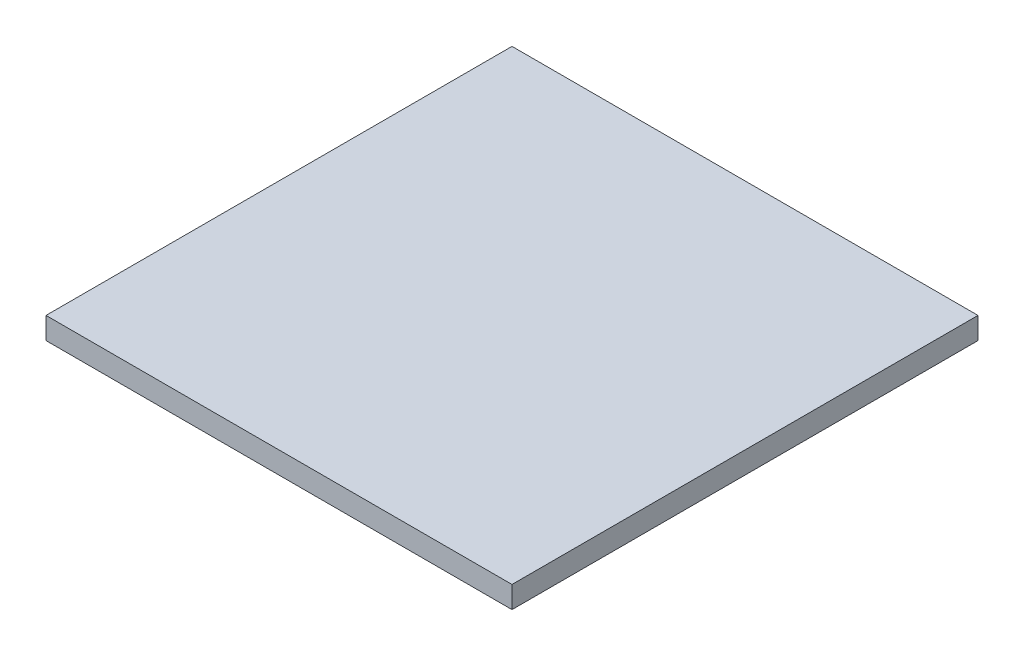
ISO-10303-21;
HEADER;
FILE_DESCRIPTION(('STEP AP214'),'2;1');
FILE_NAME('part.step','',(''),(''),'','','');
FILE_SCHEMA(('AUTOMOTIVE_DESIGN { 1 0 10303 214 1 1 1 1 }'));
ENDSEC;
DATA;
#1=APPLICATION_CONTEXT('core data for automotive mechanical design processes');
#2=APPLICATION_PROTOCOL_DEFINITION('international standard','automotive_design',2000,#1);
#3=PRODUCT_CONTEXT('',#1,'mechanical');
#4=PRODUCT('Part','Part','',(#3));
#5=PRODUCT_RELATED_PRODUCT_CATEGORY('part','',(#4));
#6=PRODUCT_DEFINITION_FORMATION('','',#4);
#7=PRODUCT_DEFINITION_CONTEXT('part definition',#1,'design');
#8=PRODUCT_DEFINITION('design','',#6,#7);
#9=PRODUCT_DEFINITION_SHAPE('','',#8);
#10=(LENGTH_UNIT() NAMED_UNIT(*) SI_UNIT(.MILLI.,.METRE.));
#11=(NAMED_UNIT(*) PLANE_ANGLE_UNIT() SI_UNIT($,.RADIAN.));
#12=(NAMED_UNIT(*) SI_UNIT($,.STERADIAN.) SOLID_ANGLE_UNIT());
#13=UNCERTAINTY_MEASURE_WITH_UNIT(LENGTH_MEASURE(1.E-05),#10,'distance_accuracy_value','');
#14=(GEOMETRIC_REPRESENTATION_CONTEXT(3) GLOBAL_UNCERTAINTY_ASSIGNED_CONTEXT((#13)) GLOBAL_UNIT_ASSIGNED_CONTEXT((#10,
#11,#12)) REPRESENTATION_CONTEXT('',''));
#15=CARTESIAN_POINT('',(0.,0.,0.));
#16=DIRECTION('',(0.,0.,1.));
#17=DIRECTION('',(1.,0.,0.));
#18=AXIS2_PLACEMENT_3D('',#15,#16,#17);
#19=CARTESIAN_POINT('',(149.225,13.97,149.225));
#20=DIRECTION('',(-1.,0.,0.));
#21=DIRECTION('',(0.,0.,1.));
#22=AXIS2_PLACEMENT_3D('',#19,#20,#21);
#23=PLANE('',#22);
#24=DIRECTION('',(0.,0.,-1.));
#25=VECTOR('',#24,1.);
#26=CARTESIAN_POINT('',(149.225,0.,149.225));
#27=LINE('',#26,#25);
#28=CARTESIAN_POINT('',(149.225,0.,149.225));
#29=VERTEX_POINT('',#28);
#30=CARTESIAN_POINT('',(149.225,0.,-149.225));
#31=VERTEX_POINT('',#30);
#32=EDGE_CURVE('E109',#29,#31,#27,.T.);
#33=ORIENTED_EDGE('',*,*,#32,.T.);
#34=DIRECTION('',(0.,-1.,0.));
#35=VECTOR('',#34,1.);
#36=CARTESIAN_POINT('',(149.225,13.97,-149.225));
#37=LINE('',#36,#35);
#38=CARTESIAN_POINT('',(149.225,13.97,-149.225));
#39=VERTEX_POINT('',#38);
#40=EDGE_CURVE('E11',#39,#31,#37,.T.);
#41=ORIENTED_EDGE('',*,*,#40,.F.);
#42=DIRECTION('',(0.,0.,-1.));
#43=VECTOR('',#42,1.);
#44=CARTESIAN_POINT('',(149.225,13.97,149.225));
#45=LINE('',#44,#43);
#46=CARTESIAN_POINT('',(149.225,13.97,149.225));
#47=VERTEX_POINT('',#46);
#48=EDGE_CURVE('E93',#47,#39,#45,.T.);
#49=ORIENTED_EDGE('',*,*,#48,.F.);
#50=DIRECTION('',(0.,-1.,0.));
#51=VECTOR('',#50,1.);
#52=CARTESIAN_POINT('',(149.225,13.97,149.225));
#53=LINE('',#52,#51);
#54=EDGE_CURVE('E105',#47,#29,#53,.T.);
#55=ORIENTED_EDGE('',*,*,#54,.T.);
#56=EDGE_LOOP('',(#33,#41,#49,#55));
#57=FACE_BOUND('',#56,.T.);
#58=ADVANCED_FACE('F41',(#57),#23,.F.);
#59=CARTESIAN_POINT('',(-149.225,13.97,-149.225));
#60=DIRECTION('',(0.,0.,1.));
#61=DIRECTION('',(1.,0.,0.));
#62=AXIS2_PLACEMENT_3D('',#59,#60,#61);
#63=PLANE('',#62);
#64=DIRECTION('',(-1.,0.,0.));
#65=VECTOR('',#64,1.);
#66=CARTESIAN_POINT('',(-149.225,0.,-149.225));
#67=LINE('',#66,#65);
#68=CARTESIAN_POINT('',(-149.225,0.,-149.225));
#69=VERTEX_POINT('',#68);
#70=EDGE_CURVE('E98',#31,#69,#67,.T.);
#71=ORIENTED_EDGE('',*,*,#70,.T.);
#72=DIRECTION('',(0.,-1.,0.));
#73=VECTOR('',#72,1.);
#74=CARTESIAN_POINT('',(-149.225,13.97,-149.225));
#75=LINE('',#74,#73);
#76=CARTESIAN_POINT('',(-149.225,13.97,-149.225));
#77=VERTEX_POINT('',#76);
#78=EDGE_CURVE('E50',#77,#69,#75,.T.);
#79=ORIENTED_EDGE('',*,*,#78,.F.);
#80=DIRECTION('',(-1.,0.,0.));
#81=VECTOR('',#80,1.);
#82=CARTESIAN_POINT('',(-149.225,13.97,-149.225));
#83=LINE('',#82,#81);
#84=EDGE_CURVE('E88',#39,#77,#83,.T.);
#85=ORIENTED_EDGE('',*,*,#84,.F.);
#86=ORIENTED_EDGE('',*,*,#40,.T.);
#87=EDGE_LOOP('',(#71,#79,#85,#86));
#88=FACE_BOUND('',#87,.T.);
#89=ADVANCED_FACE('F97',(#88),#63,.F.);
#90=CARTESIAN_POINT('',(-149.225,13.97,149.225));
#91=DIRECTION('',(1.,0.,0.));
#92=DIRECTION('',(0.,0.,-1.));
#93=AXIS2_PLACEMENT_3D('',#90,#91,#92);
#94=PLANE('',#93);
#95=DIRECTION('',(0.,0.,1.));
#96=VECTOR('',#95,1.);
#97=CARTESIAN_POINT('',(-149.225,0.,149.225));
#98=LINE('',#97,#96);
#99=CARTESIAN_POINT('',(-149.225,0.,149.225));
#100=VERTEX_POINT('',#99);
#101=EDGE_CURVE('E75',#69,#100,#98,.T.);
#102=ORIENTED_EDGE('',*,*,#101,.T.);
#103=DIRECTION('',(0.,-1.,0.));
#104=VECTOR('',#103,1.);
#105=CARTESIAN_POINT('',(-149.225,13.97,149.225));
#106=LINE('',#105,#104);
#107=CARTESIAN_POINT('',(-149.225,13.97,149.225));
#108=VERTEX_POINT('',#107);
#109=EDGE_CURVE('E100',#108,#100,#106,.T.);
#110=ORIENTED_EDGE('',*,*,#109,.F.);
#111=DIRECTION('',(0.,0.,1.));
#112=VECTOR('',#111,1.);
#113=CARTESIAN_POINT('',(-149.225,13.97,149.225));
#114=LINE('',#113,#112);
#115=EDGE_CURVE('E91',#77,#108,#114,.T.);
#116=ORIENTED_EDGE('',*,*,#115,.F.);
#117=ORIENTED_EDGE('',*,*,#78,.T.);
#118=EDGE_LOOP('',(#102,#110,#116,#117));
#119=FACE_BOUND('',#118,.T.);
#120=ADVANCED_FACE('F101',(#119),#94,.F.);
#121=CARTESIAN_POINT('',(-149.225,13.97,149.225));
#122=DIRECTION('',(0.,0.,-1.));
#123=DIRECTION('',(-1.,0.,0.));
#124=AXIS2_PLACEMENT_3D('',#121,#122,#123);
#125=PLANE('',#124);
#126=DIRECTION('',(1.,0.,0.));
#127=VECTOR('',#126,1.);
#128=CARTESIAN_POINT('',(-149.225,0.,149.225));
#129=LINE('',#128,#127);
#130=EDGE_CURVE('E81',#100,#29,#129,.T.);
#131=ORIENTED_EDGE('',*,*,#130,.T.);
#132=ORIENTED_EDGE('',*,*,#54,.F.);
#133=DIRECTION('',(1.,0.,0.));
#134=VECTOR('',#133,1.);
#135=CARTESIAN_POINT('',(-149.225,13.97,149.225));
#136=LINE('',#135,#134);
#137=EDGE_CURVE('E58',#108,#47,#136,.T.);
#138=ORIENTED_EDGE('',*,*,#137,.F.);
#139=ORIENTED_EDGE('',*,*,#109,.T.);
#140=EDGE_LOOP('',(#131,#132,#138,#139));
#141=FACE_BOUND('',#140,.T.);
#142=ADVANCED_FACE('F122',(#141),#125,.F.);
#143=CARTESIAN_POINT('',(0.,13.97,0.));
#144=DIRECTION('',(0.,-1.,0.));
#145=DIRECTION('',(0.,0.,-1.));
#146=AXIS2_PLACEMENT_3D('',#143,#144,#145);
#147=PLANE('',#146);
#148=ORIENTED_EDGE('',*,*,#48,.T.);
#149=ORIENTED_EDGE('',*,*,#84,.T.);
#150=ORIENTED_EDGE('',*,*,#115,.T.);
#151=ORIENTED_EDGE('',*,*,#137,.T.);
#152=EDGE_LOOP('',(#148,#149,#150,#151));
#153=FACE_BOUND('',#152,.T.);
#154=ADVANCED_FACE('F89',(#153),#147,.F.);
#155=CARTESIAN_POINT('',(0.,0.,0.));
#156=DIRECTION('',(0.,-1.,0.));
#157=DIRECTION('',(0.,0.,-1.));
#158=AXIS2_PLACEMENT_3D('',#155,#156,#157);
#159=PLANE('',#158);
#160=ORIENTED_EDGE('',*,*,#32,.F.);
#161=ORIENTED_EDGE('',*,*,#130,.F.);
#162=ORIENTED_EDGE('',*,*,#101,.F.);
#163=ORIENTED_EDGE('',*,*,#70,.F.);
#164=EDGE_LOOP('',(#160,#161,#162,#163));
#165=FACE_BOUND('',#164,.T.);
#166=ADVANCED_FACE('F125',(#165),#159,.T.);
#167=CLOSED_SHELL('',(#58,#89,#120,#142,#154,#166));
#168=MANIFOLD_SOLID_BREP('B2',#167);
#169=ADVANCED_BREP_SHAPE_REPRESENTATION('',(#18,#168),#14);
#170=SHAPE_DEFINITION_REPRESENTATION(#9,#169);
ENDSEC;
END-ISO-10303-21;
